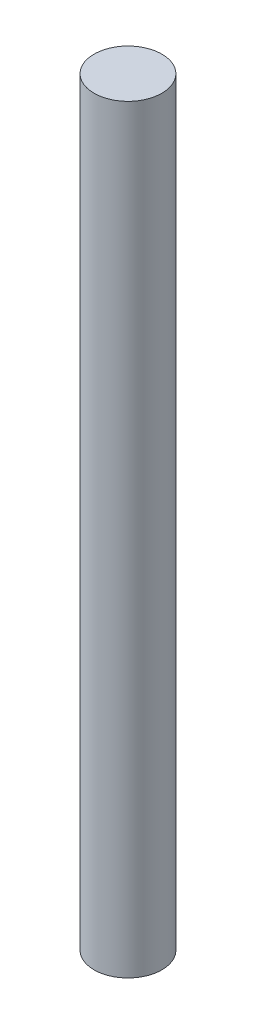
ISO-10303-21;
HEADER;
FILE_DESCRIPTION(('STEP AP214'),'2;1');
FILE_NAME('part.step','',(''),(''),'','','');
FILE_SCHEMA(('AUTOMOTIVE_DESIGN { 1 0 10303 214 1 1 1 1 }'));
ENDSEC;
DATA;
#1=APPLICATION_CONTEXT('core data for automotive mechanical design processes');
#2=APPLICATION_PROTOCOL_DEFINITION('international standard','automotive_design',2000,#1);
#3=PRODUCT_CONTEXT('',#1,'mechanical');
#4=PRODUCT('Part','Part','',(#3));
#5=PRODUCT_RELATED_PRODUCT_CATEGORY('part','',(#4));
#6=PRODUCT_DEFINITION_FORMATION('','',#4);
#7=PRODUCT_DEFINITION_CONTEXT('part definition',#1,'design');
#8=PRODUCT_DEFINITION('design','',#6,#7);
#9=PRODUCT_DEFINITION_SHAPE('','',#8);
#10=(LENGTH_UNIT() NAMED_UNIT(*) SI_UNIT(.MILLI.,.METRE.));
#11=(NAMED_UNIT(*) PLANE_ANGLE_UNIT() SI_UNIT($,.RADIAN.));
#12=(NAMED_UNIT(*) SI_UNIT($,.STERADIAN.) SOLID_ANGLE_UNIT());
#13=UNCERTAINTY_MEASURE_WITH_UNIT(LENGTH_MEASURE(1.E-05),#10,'distance_accuracy_value','');
#14=(GEOMETRIC_REPRESENTATION_CONTEXT(3) GLOBAL_UNCERTAINTY_ASSIGNED_CONTEXT((#13)) GLOBAL_UNIT_ASSIGNED_CONTEXT((#10,
#11,#12)) REPRESENTATION_CONTEXT('',''));
#15=CARTESIAN_POINT('',(0.,0.,0.));
#16=DIRECTION('',(0.,0.,1.));
#17=DIRECTION('',(1.,0.,0.));
#18=AXIS2_PLACEMENT_3D('',#15,#16,#17);
#19=CARTESIAN_POINT('',(0.,28.,0.));
#20=DIRECTION('',(0.,-1.,0.));
#21=DIRECTION('',(0.,0.,-1.));
#22=AXIS2_PLACEMENT_3D('',#19,#20,#21);
#23=CYLINDRICAL_SURFACE('',#22,2.5);
#24=CARTESIAN_POINT('',(0.,28.,0.));
#25=DIRECTION('',(0.,1.,0.));
#26=DIRECTION('',(0.,0.,1.));
#27=AXIS2_PLACEMENT_3D('',#24,#25,#26);
#28=CIRCLE('',#27,2.5);
#29=CARTESIAN_POINT('',(0.,28.,2.5));
#30=VERTEX_POINT('',#29);
#31=EDGE_CURVE('E10',#30,#30,#28,.T.);
#32=ORIENTED_EDGE('',*,*,#31,.F.);
#33=EDGE_LOOP('',(#32));
#34=FACE_BOUND('',#33,.T.);
#35=CARTESIAN_POINT('',(0.,-28.,0.));
#36=DIRECTION('',(0.,1.,0.));
#37=DIRECTION('',(0.,0.,1.));
#38=AXIS2_PLACEMENT_3D('',#35,#36,#37);
#39=CIRCLE('',#38,2.5);
#40=CARTESIAN_POINT('',(0.,-28.,2.5));
#41=VERTEX_POINT('',#40);
#42=EDGE_CURVE('E44',#41,#41,#39,.T.);
#43=ORIENTED_EDGE('',*,*,#42,.T.);
#44=EDGE_LOOP('',(#43));
#45=FACE_BOUND('',#44,.T.);
#46=ADVANCED_FACE('F41',(#34,#45),#23,.T.);
#47=CARTESIAN_POINT('',(0.,28.,0.));
#48=DIRECTION('',(0.,1.,0.));
#49=DIRECTION('',(0.,0.,1.));
#50=AXIS2_PLACEMENT_3D('',#47,#48,#49);
#51=PLANE('',#50);
#52=ORIENTED_EDGE('',*,*,#31,.T.);
#53=EDGE_LOOP('',(#52));
#54=FACE_BOUND('',#53,.T.);
#55=ADVANCED_FACE('F58',(#54),#51,.T.);
#56=CARTESIAN_POINT('',(0.,-28.,0.));
#57=DIRECTION('',(0.,1.,0.));
#58=DIRECTION('',(0.,0.,1.));
#59=AXIS2_PLACEMENT_3D('',#56,#57,#58);
#60=PLANE('',#59);
#61=ORIENTED_EDGE('',*,*,#42,.F.);
#62=EDGE_LOOP('',(#61));
#63=FACE_BOUND('',#62,.T.);
#64=ADVANCED_FACE('F56',(#63),#60,.F.);
#65=CLOSED_SHELL('',(#46,#55,#64));
#66=MANIFOLD_SOLID_BREP('B2',#65);
#67=ADVANCED_BREP_SHAPE_REPRESENTATION('',(#18,#66),#14);
#68=SHAPE_DEFINITION_REPRESENTATION(#9,#67);
ENDSEC;
END-ISO-10303-21;
